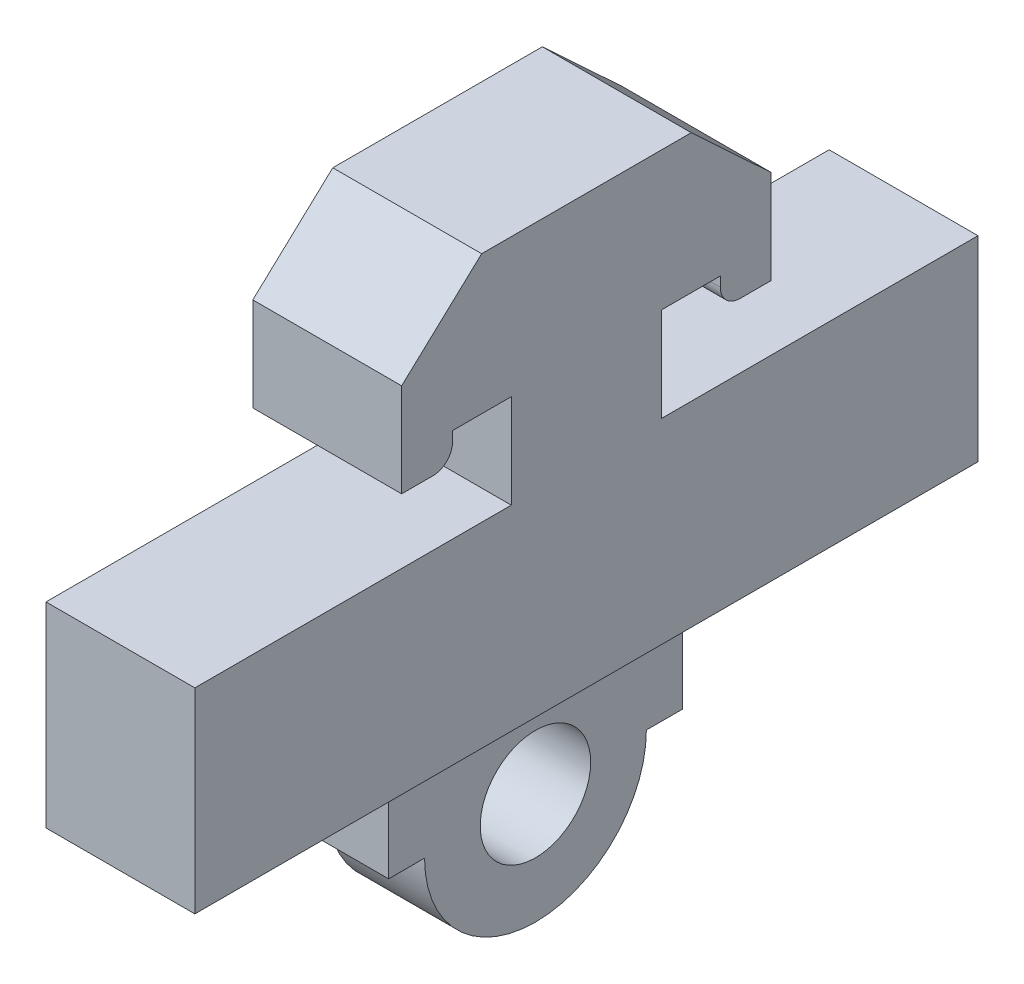
ISO-10303-21;
HEADER;
FILE_DESCRIPTION(('STEP AP214'),'2;1');
FILE_NAME('part.step','',(''),(''),'','','');
FILE_SCHEMA(('AUTOMOTIVE_DESIGN { 1 0 10303 214 1 1 1 1 }'));
ENDSEC;
DATA;
#1=APPLICATION_CONTEXT('core data for automotive mechanical design processes');
#2=APPLICATION_PROTOCOL_DEFINITION('international standard','automotive_design',2000,#1);
#3=PRODUCT_CONTEXT('',#1,'mechanical');
#4=PRODUCT('Part','Part','',(#3));
#5=PRODUCT_RELATED_PRODUCT_CATEGORY('part','',(#4));
#6=PRODUCT_DEFINITION_FORMATION('','',#4);
#7=PRODUCT_DEFINITION_CONTEXT('part definition',#1,'design');
#8=PRODUCT_DEFINITION('design','',#6,#7);
#9=PRODUCT_DEFINITION_SHAPE('','',#8);
#10=(LENGTH_UNIT() NAMED_UNIT(*) SI_UNIT(.MILLI.,.METRE.));
#11=(NAMED_UNIT(*) PLANE_ANGLE_UNIT() SI_UNIT($,.RADIAN.));
#12=(NAMED_UNIT(*) SI_UNIT($,.STERADIAN.) SOLID_ANGLE_UNIT());
#13=UNCERTAINTY_MEASURE_WITH_UNIT(LENGTH_MEASURE(1.E-05),#10,'distance_accuracy_value','');
#14=(GEOMETRIC_REPRESENTATION_CONTEXT(3) GLOBAL_UNCERTAINTY_ASSIGNED_CONTEXT((#13)) GLOBAL_UNIT_ASSIGNED_CONTEXT((#10,
#11,#12)) REPRESENTATION_CONTEXT('',''));
#15=CARTESIAN_POINT('',(0.,0.,0.));
#16=DIRECTION('',(0.,0.,1.));
#17=DIRECTION('',(1.,0.,0.));
#18=AXIS2_PLACEMENT_3D('',#15,#16,#17);
#19=CARTESIAN_POINT('',(0.,10.,0.));
#20=DIRECTION('',(0.,-1.,0.));
#21=DIRECTION('',(0.,0.,-1.));
#22=AXIS2_PLACEMENT_3D('',#19,#20,#21);
#23=PLANE('',#22);
#24=DIRECTION('',(-1.,0.,0.));
#25=VECTOR('',#24,1.);
#26=CARTESIAN_POINT('',(64.7036979563974,10.,-3.83822735647703));
#27=LINE('',#26,#25);
#28=CARTESIAN_POINT('',(-34.7966718517997,10.,-3.83822735647703));
#29=VERTEX_POINT('',#28);
#30=CARTESIAN_POINT('',(-42.4,10.,-3.83822735647703));
#31=VERTEX_POINT('',#30);
#32=EDGE_CURVE('E257',#29,#31,#27,.T.);
#33=ORIENTED_EDGE('',*,*,#32,.F.);
#34=DIRECTION('',(0.,0.,-1.));
#35=VECTOR('',#34,1.);
#36=CARTESIAN_POINT('',(-34.7966718517997,10.,0.));
#37=LINE('',#36,#35);
#38=CARTESIAN_POINT('',(-34.7966718517997,10.,-20.));
#39=VERTEX_POINT('',#38);
#40=EDGE_CURVE('E393',#29,#39,#37,.T.);
#41=ORIENTED_EDGE('',*,*,#40,.T.);
#42=DIRECTION('',(-1.,0.,0.));
#43=VECTOR('',#42,1.);
#44=CARTESIAN_POINT('',(-37.4,10.,-20.));
#45=LINE('',#44,#43);
#46=CARTESIAN_POINT('',(-42.4,10.,-20.));
#47=VERTEX_POINT('',#46);
#48=EDGE_CURVE('E336',#39,#47,#45,.T.);
#49=ORIENTED_EDGE('',*,*,#48,.T.);
#50=DIRECTION('',(0.,0.,1.));
#51=VECTOR('',#50,1.);
#52=CARTESIAN_POINT('',(-42.4,10.,0.));
#53=LINE('',#52,#51);
#54=EDGE_CURVE('E288',#47,#31,#53,.T.);
#55=ORIENTED_EDGE('',*,*,#54,.T.);
#56=EDGE_LOOP('',(#33,#41,#49,#55));
#57=FACE_BOUND('',#56,.T.);
#58=ADVANCED_FACE('F38',(#57),#23,.F.);
#59=CARTESIAN_POINT('',(-37.4,10.,-20.));
#60=DIRECTION('',(0.,0.,1.));
#61=DIRECTION('',(1.,0.,0.));
#62=AXIS2_PLACEMENT_3D('',#59,#60,#61);
#63=PLANE('',#62);
#64=ORIENTED_EDGE('',*,*,#48,.F.);
#65=DIRECTION('',(0.,1.,0.));
#66=VECTOR('',#65,1.);
#67=CARTESIAN_POINT('',(-34.7966718517997,-37.12,-20.));
#68=LINE('',#67,#66);
#69=CARTESIAN_POINT('',(-34.7966718517997,0.,-20.));
#70=VERTEX_POINT('',#69);
#71=EDGE_CURVE('E228',#70,#39,#68,.T.);
#72=ORIENTED_EDGE('',*,*,#71,.F.);
#73=DIRECTION('',(-1.,0.,0.));
#74=VECTOR('',#73,1.);
#75=CARTESIAN_POINT('',(-37.4,0.,-20.));
#76=LINE('',#75,#74);
#77=CARTESIAN_POINT('',(-42.4,0.,-20.));
#78=VERTEX_POINT('',#77);
#79=EDGE_CURVE('E335',#70,#78,#76,.T.);
#80=ORIENTED_EDGE('',*,*,#79,.T.);
#81=DIRECTION('',(0.,1.,0.));
#82=VECTOR('',#81,1.);
#83=CARTESIAN_POINT('',(-42.4,0.,-20.));
#84=LINE('',#83,#82);
#85=EDGE_CURVE('E291',#78,#47,#84,.T.);
#86=ORIENTED_EDGE('',*,*,#85,.T.);
#87=EDGE_LOOP('',(#64,#72,#80,#86));
#88=FACE_BOUND('',#87,.T.);
#89=ADVANCED_FACE('F40',(#88),#63,.F.);
#90=CARTESIAN_POINT('',(-37.4,10.,20.));
#91=DIRECTION('',(0.,0.,-1.));
#92=DIRECTION('',(-1.,0.,0.));
#93=AXIS2_PLACEMENT_3D('',#90,#91,#92);
#94=PLANE('',#93);
#95=DIRECTION('',(1.,0.,0.));
#96=VECTOR('',#95,1.);
#97=CARTESIAN_POINT('',(-37.4,0.,20.));
#98=LINE('',#97,#96);
#99=CARTESIAN_POINT('',(-42.4,0.,20.));
#100=VERTEX_POINT('',#99);
#101=CARTESIAN_POINT('',(-34.7966718517997,0.,20.));
#102=VERTEX_POINT('',#101);
#103=EDGE_CURVE('E338',#100,#102,#98,.T.);
#104=ORIENTED_EDGE('',*,*,#103,.T.);
#105=DIRECTION('',(0.,1.,0.));
#106=VECTOR('',#105,1.);
#107=CARTESIAN_POINT('',(-34.7966718517997,-37.12,20.));
#108=LINE('',#107,#106);
#109=CARTESIAN_POINT('',(-34.7966718517997,10.,20.));
#110=VERTEX_POINT('',#109);
#111=EDGE_CURVE('E348',#102,#110,#108,.T.);
#112=ORIENTED_EDGE('',*,*,#111,.T.);
#113=DIRECTION('',(1.,0.,0.));
#114=VECTOR('',#113,1.);
#115=CARTESIAN_POINT('',(-37.4,10.,20.));
#116=LINE('',#115,#114);
#117=CARTESIAN_POINT('',(-42.4,10.,20.));
#118=VERTEX_POINT('',#117);
#119=EDGE_CURVE('E46',#118,#110,#116,.T.);
#120=ORIENTED_EDGE('',*,*,#119,.F.);
#121=DIRECTION('',(0.,-1.,0.));
#122=VECTOR('',#121,1.);
#123=CARTESIAN_POINT('',(-42.4,0.,20.));
#124=LINE('',#123,#122);
#125=EDGE_CURVE('E283',#118,#100,#124,.T.);
#126=ORIENTED_EDGE('',*,*,#125,.T.);
#127=EDGE_LOOP('',(#104,#112,#120,#126));
#128=FACE_BOUND('',#127,.T.);
#129=ADVANCED_FACE('F346',(#128),#94,.F.);
#130=ORIENTED_EDGE('',*,*,#119,.T.);
#131=DIRECTION('',(0.,0.,-1.));
#132=VECTOR('',#131,1.);
#133=CARTESIAN_POINT('',(-34.7966718517997,10.,0.));
#134=LINE('',#133,#132);
#135=CARTESIAN_POINT('',(-34.7966718517997,10.,3.83822735647703));
#136=VERTEX_POINT('',#135);
#137=EDGE_CURVE('E413',#110,#136,#134,.T.);
#138=ORIENTED_EDGE('',*,*,#137,.T.);
#139=DIRECTION('',(-1.,0.,0.));
#140=VECTOR('',#139,1.);
#141=CARTESIAN_POINT('',(64.7036979563974,10.,3.83822735647703));
#142=LINE('',#141,#140);
#143=CARTESIAN_POINT('',(-42.4,10.,3.83822735647703));
#144=VERTEX_POINT('',#143);
#145=EDGE_CURVE('E60',#136,#144,#142,.T.);
#146=ORIENTED_EDGE('',*,*,#145,.T.);
#147=EDGE_CURVE('E287',#144,#118,#53,.T.);
#148=ORIENTED_EDGE('',*,*,#147,.T.);
#149=EDGE_LOOP('',(#130,#138,#146,#148));
#150=FACE_BOUND('',#149,.T.);
#151=ADVANCED_FACE('F470',(#150),#23,.F.);
#152=CARTESIAN_POINT('',(0.,0.,0.));
#153=DIRECTION('',(0.,-1.,0.));
#154=DIRECTION('',(0.,0.,-1.));
#155=AXIS2_PLACEMENT_3D('',#152,#153,#154);
#156=PLANE('',#155);
#157=DIRECTION('',(0.,0.,-1.));
#158=VECTOR('',#157,1.);
#159=CARTESIAN_POINT('',(-34.7966718517997,0.,0.));
#160=LINE('',#159,#158);
#161=EDGE_CURVE('E269',#102,#70,#160,.T.);
#162=ORIENTED_EDGE('',*,*,#161,.F.);
#163=ORIENTED_EDGE('',*,*,#103,.F.);
#164=DIRECTION('',(0.,0.,-1.));
#165=VECTOR('',#164,1.);
#166=CARTESIAN_POINT('',(-42.4,0.,0.));
#167=LINE('',#166,#165);
#168=CARTESIAN_POINT('',(-42.4,0.,7.5));
#169=VERTEX_POINT('',#168);
#170=EDGE_CURVE('E280',#100,#169,#167,.T.);
#171=ORIENTED_EDGE('',*,*,#170,.T.);
#172=DIRECTION('',(1.,0.,0.));
#173=VECTOR('',#172,1.);
#174=CARTESIAN_POINT('',(-42.4,0.,7.5));
#175=LINE('',#174,#173);
#176=CARTESIAN_POINT('',(-37.4,0.,7.5));
#177=VERTEX_POINT('',#176);
#178=EDGE_CURVE('E330',#169,#177,#175,.T.);
#179=ORIENTED_EDGE('',*,*,#178,.T.);
#180=DIRECTION('',(0.,0.,1.));
#181=VECTOR('',#180,1.);
#182=CARTESIAN_POINT('',(-37.4,0.,20.));
#183=LINE('',#182,#181);
#184=CARTESIAN_POINT('',(-37.4,0.,-7.5));
#185=VERTEX_POINT('',#184);
#186=EDGE_CURVE('E342',#185,#177,#183,.T.);
#187=ORIENTED_EDGE('',*,*,#186,.F.);
#188=DIRECTION('',(1.,0.,0.));
#189=VECTOR('',#188,1.);
#190=CARTESIAN_POINT('',(-42.4,0.,-7.5));
#191=LINE('',#190,#189);
#192=CARTESIAN_POINT('',(-42.4,0.,-7.5));
#193=VERTEX_POINT('',#192);
#194=EDGE_CURVE('E327',#193,#185,#191,.T.);
#195=ORIENTED_EDGE('',*,*,#194,.F.);
#196=EDGE_CURVE('E284',#193,#78,#167,.T.);
#197=ORIENTED_EDGE('',*,*,#196,.T.);
#198=ORIENTED_EDGE('',*,*,#79,.F.);
#199=EDGE_LOOP('',(#162,#163,#171,#179,#187,#195,#197,#198));
#200=FACE_BOUND('',#199,.T.);
#201=ADVANCED_FACE('F353',(#200),#156,.T.);
#202=CARTESIAN_POINT('',(-37.4,0.,0.));
#203=DIRECTION('',(-1.,0.,0.));
#204=DIRECTION('',(0.,0.,-1.));
#205=AXIS2_PLACEMENT_3D('',#202,#203,#204);
#206=PLANE('',#205);
#207=CARTESIAN_POINT('',(-37.4,-6.,0.));
#208=DIRECTION('',(1.,0.,0.));
#209=DIRECTION('',(0.,0.,-1.));
#210=AXIS2_PLACEMENT_3D('',#207,#208,#209);
#211=CIRCLE('',#210,2.82);
#212=CARTESIAN_POINT('',(-37.4,-6.,-2.82));
#213=VERTEX_POINT('',#212);
#214=EDGE_CURVE('E304',#213,#213,#211,.T.);
#215=ORIENTED_EDGE('',*,*,#214,.F.);
#216=EDGE_LOOP('',(#215));
#217=FACE_BOUND('',#216,.T.);
#218=DIRECTION('',(0.,1.,0.));
#219=VECTOR('',#218,1.);
#220=CARTESIAN_POINT('',(-37.4,0.,-7.5));
#221=LINE('',#220,#219);
#222=CARTESIAN_POINT('',(-37.4,-6.,-7.5));
#223=VERTEX_POINT('',#222);
#224=EDGE_CURVE('E314',#223,#185,#221,.T.);
#225=ORIENTED_EDGE('',*,*,#224,.T.);
#226=ORIENTED_EDGE('',*,*,#186,.T.);
#227=DIRECTION('',(0.,-1.,0.));
#228=VECTOR('',#227,1.);
#229=CARTESIAN_POINT('',(-37.4,0.,7.5));
#230=LINE('',#229,#228);
#231=CARTESIAN_POINT('',(-37.4,-6.,7.5));
#232=VERTEX_POINT('',#231);
#233=EDGE_CURVE('E311',#177,#232,#230,.T.);
#234=ORIENTED_EDGE('',*,*,#233,.T.);
#235=DIRECTION('',(0.,0.,-1.));
#236=VECTOR('',#235,1.);
#237=CARTESIAN_POINT('',(-37.4,-6.,0.));
#238=LINE('',#237,#236);
#239=CARTESIAN_POINT('',(-37.4,-6.,5.665));
#240=VERTEX_POINT('',#239);
#241=EDGE_CURVE('E307',#232,#240,#238,.T.);
#242=ORIENTED_EDGE('',*,*,#241,.T.);
#243=CARTESIAN_POINT('',(-37.4,-6.,0.));
#244=DIRECTION('',(1.,0.,0.));
#245=DIRECTION('',(0.,0.,-1.));
#246=AXIS2_PLACEMENT_3D('',#243,#244,#245);
#247=CIRCLE('',#246,5.665);
#248=CARTESIAN_POINT('',(-37.4,-6.,-5.665));
#249=VERTEX_POINT('',#248);
#250=EDGE_CURVE('E274',#240,#249,#247,.T.);
#251=ORIENTED_EDGE('',*,*,#250,.T.);
#252=DIRECTION('',(0.,0.,-1.));
#253=VECTOR('',#252,1.);
#254=CARTESIAN_POINT('',(-37.4,-6.,0.));
#255=LINE('',#254,#253);
#256=EDGE_CURVE('E317',#249,#223,#255,.T.);
#257=ORIENTED_EDGE('',*,*,#256,.T.);
#258=EDGE_LOOP('',(#225,#226,#234,#242,#251,#257));
#259=FACE_BOUND('',#258,.T.);
#260=ADVANCED_FACE('F371',(#217,#259),#206,.F.);
#261=CARTESIAN_POINT('',(-42.4,-6.,0.));
#262=DIRECTION('',(0.,-1.,0.));
#263=DIRECTION('',(0.,0.,-1.));
#264=AXIS2_PLACEMENT_3D('',#261,#262,#263);
#265=PLANE('',#264);
#266=ORIENTED_EDGE('',*,*,#241,.F.);
#267=DIRECTION('',(1.,0.,0.));
#268=VECTOR('',#267,1.);
#269=CARTESIAN_POINT('',(-42.4,-6.,7.5));
#270=LINE('',#269,#268);
#271=CARTESIAN_POINT('',(-42.4,-6.,7.5));
#272=VERTEX_POINT('',#271);
#273=EDGE_CURVE('E333',#272,#232,#270,.T.);
#274=ORIENTED_EDGE('',*,*,#273,.F.);
#275=DIRECTION('',(0.,0.,-1.));
#276=VECTOR('',#275,1.);
#277=CARTESIAN_POINT('',(-42.4,-6.,0.));
#278=LINE('',#277,#276);
#279=CARTESIAN_POINT('',(-42.4,-6.,5.665));
#280=VERTEX_POINT('',#279);
#281=EDGE_CURVE('E273',#272,#280,#278,.T.);
#282=ORIENTED_EDGE('',*,*,#281,.T.);
#283=DIRECTION('',(1.,0.,0.));
#284=VECTOR('',#283,1.);
#285=CARTESIAN_POINT('',(-42.4,-6.,5.665));
#286=LINE('',#285,#284);
#287=EDGE_CURVE('E303',#280,#240,#286,.T.);
#288=ORIENTED_EDGE('',*,*,#287,.T.);
#289=EDGE_LOOP('',(#266,#274,#282,#288));
#290=FACE_BOUND('',#289,.T.);
#291=ADVANCED_FACE('F730',(#290),#265,.T.);
#292=CARTESIAN_POINT('',(-42.4,0.,7.5));
#293=DIRECTION('',(0.,0.,1.));
#294=DIRECTION('',(0.,-1.,0.));
#295=AXIS2_PLACEMENT_3D('',#292,#293,#294);
#296=PLANE('',#295);
#297=ORIENTED_EDGE('',*,*,#233,.F.);
#298=ORIENTED_EDGE('',*,*,#178,.F.);
#299=DIRECTION('',(0.,-1.,0.));
#300=VECTOR('',#299,1.);
#301=CARTESIAN_POINT('',(-42.4,0.,7.5));
#302=LINE('',#301,#300);
#303=EDGE_CURVE('E277',#169,#272,#302,.T.);
#304=ORIENTED_EDGE('',*,*,#303,.T.);
#305=ORIENTED_EDGE('',*,*,#273,.T.);
#306=EDGE_LOOP('',(#297,#298,#304,#305));
#307=FACE_BOUND('',#306,.T.);
#308=ADVANCED_FACE('F362',(#307),#296,.T.);
#309=CARTESIAN_POINT('',(-42.4,0.,-7.5));
#310=DIRECTION('',(0.,0.,-1.));
#311=DIRECTION('',(0.,1.,0.));
#312=AXIS2_PLACEMENT_3D('',#309,#310,#311);
#313=PLANE('',#312);
#314=ORIENTED_EDGE('',*,*,#224,.F.);
#315=DIRECTION('',(1.,0.,0.));
#316=VECTOR('',#315,1.);
#317=CARTESIAN_POINT('',(-42.4,-6.,-7.5));
#318=LINE('',#317,#316);
#319=CARTESIAN_POINT('',(-42.4,-6.,-7.5));
#320=VERTEX_POINT('',#319);
#321=EDGE_CURVE('E325',#320,#223,#318,.T.);
#322=ORIENTED_EDGE('',*,*,#321,.F.);
#323=DIRECTION('',(0.,1.,0.));
#324=VECTOR('',#323,1.);
#325=CARTESIAN_POINT('',(-42.4,0.,-7.5));
#326=LINE('',#325,#324);
#327=EDGE_CURVE('E294',#320,#193,#326,.T.);
#328=ORIENTED_EDGE('',*,*,#327,.T.);
#329=ORIENTED_EDGE('',*,*,#194,.T.);
#330=EDGE_LOOP('',(#314,#322,#328,#329));
#331=FACE_BOUND('',#330,.T.);
#332=ADVANCED_FACE('F369',(#331),#313,.T.);
#333=CARTESIAN_POINT('',(-42.4,-6.,0.));
#334=DIRECTION('',(0.,-1.,0.));
#335=DIRECTION('',(0.,0.,-1.));
#336=AXIS2_PLACEMENT_3D('',#333,#334,#335);
#337=PLANE('',#336);
#338=ORIENTED_EDGE('',*,*,#256,.F.);
#339=DIRECTION('',(1.,0.,0.));
#340=VECTOR('',#339,1.);
#341=CARTESIAN_POINT('',(-42.4,-6.,-5.665));
#342=LINE('',#341,#340);
#343=CARTESIAN_POINT('',(-42.4,-6.,-5.665));
#344=VERTEX_POINT('',#343);
#345=EDGE_CURVE('E323',#344,#249,#342,.T.);
#346=ORIENTED_EDGE('',*,*,#345,.F.);
#347=DIRECTION('',(0.,0.,-1.));
#348=VECTOR('',#347,1.);
#349=CARTESIAN_POINT('',(-42.4,-6.,0.));
#350=LINE('',#349,#348);
#351=EDGE_CURVE('E297',#344,#320,#350,.T.);
#352=ORIENTED_EDGE('',*,*,#351,.T.);
#353=ORIENTED_EDGE('',*,*,#321,.T.);
#354=EDGE_LOOP('',(#338,#346,#352,#353));
#355=FACE_BOUND('',#354,.T.);
#356=ADVANCED_FACE('F375',(#355),#337,.T.);
#357=CARTESIAN_POINT('',(-42.4,-6.,0.));
#358=DIRECTION('',(1.,0.,0.));
#359=DIRECTION('',(0.,0.,-1.));
#360=AXIS2_PLACEMENT_3D('',#357,#358,#359);
#361=CYLINDRICAL_SURFACE('',#360,2.82);
#362=CARTESIAN_POINT('',(-42.4,-6.,0.));
#363=DIRECTION('',(1.,0.,0.));
#364=DIRECTION('',(0.,0.,-1.));
#365=AXIS2_PLACEMENT_3D('',#362,#363,#364);
#366=CIRCLE('',#365,2.82);
#367=CARTESIAN_POINT('',(-42.4,-6.,-2.82));
#368=VERTEX_POINT('',#367);
#369=EDGE_CURVE('E270',#368,#368,#366,.T.);
#370=ORIENTED_EDGE('',*,*,#369,.F.);
#371=EDGE_LOOP('',(#370));
#372=FACE_BOUND('',#371,.T.);
#373=ORIENTED_EDGE('',*,*,#214,.T.);
#374=EDGE_LOOP('',(#373));
#375=FACE_BOUND('',#374,.T.);
#376=ADVANCED_FACE('F696',(#372,#375),#361,.F.);
#377=CARTESIAN_POINT('',(-42.4,-6.,0.));
#378=DIRECTION('',(1.,0.,0.));
#379=DIRECTION('',(0.,0.,-1.));
#380=AXIS2_PLACEMENT_3D('',#377,#378,#379);
#381=CYLINDRICAL_SURFACE('',#380,5.665);
#382=ORIENTED_EDGE('',*,*,#250,.F.);
#383=ORIENTED_EDGE('',*,*,#287,.F.);
#384=CARTESIAN_POINT('',(-42.4,-6.,0.));
#385=DIRECTION('',(1.,0.,0.));
#386=DIRECTION('',(0.,0.,-1.));
#387=AXIS2_PLACEMENT_3D('',#384,#385,#386);
#388=CIRCLE('',#387,5.665);
#389=EDGE_CURVE('E300',#280,#344,#388,.T.);
#390=ORIENTED_EDGE('',*,*,#389,.T.);
#391=ORIENTED_EDGE('',*,*,#345,.T.);
#392=EDGE_LOOP('',(#382,#383,#390,#391));
#393=FACE_BOUND('',#392,.T.);
#394=ADVANCED_FACE('F686',(#393),#381,.T.);
#395=CARTESIAN_POINT('',(-42.4,0.,0.));
#396=DIRECTION('',(-1.,0.,0.));
#397=DIRECTION('',(0.,0.,-1.));
#398=AXIS2_PLACEMENT_3D('',#395,#396,#397);
#399=PLANE('',#398);
#400=ORIENTED_EDGE('',*,*,#369,.T.);
#401=EDGE_LOOP('',(#400));
#402=FACE_BOUND('',#401,.T.);
#403=ORIENTED_EDGE('',*,*,#281,.F.);
#404=ORIENTED_EDGE('',*,*,#303,.F.);
#405=ORIENTED_EDGE('',*,*,#170,.F.);
#406=ORIENTED_EDGE('',*,*,#125,.F.);
#407=ORIENTED_EDGE('',*,*,#147,.F.);
#408=DIRECTION('',(0.,1.,0.));
#409=VECTOR('',#408,1.);
#410=CARTESIAN_POINT('',(-42.4,0.,3.83822735647703));
#411=LINE('',#410,#409);
#412=CARTESIAN_POINT('',(-42.4,14.8,3.83822735647703));
#413=VERTEX_POINT('',#412);
#414=EDGE_CURVE('E440',#144,#413,#411,.T.);
#415=ORIENTED_EDGE('',*,*,#414,.T.);
#416=DIRECTION('',(0.,0.,1.));
#417=VECTOR('',#416,1.);
#418=CARTESIAN_POINT('',(-42.4,14.8,0.));
#419=LINE('',#418,#417);
#420=CARTESIAN_POINT('',(-42.4,14.8,6.83822735647704));
#421=VERTEX_POINT('',#420);
#422=EDGE_CURVE('E437',#413,#421,#419,.T.);
#423=ORIENTED_EDGE('',*,*,#422,.T.);
#424=DIRECTION('',(0.,-1.,0.));
#425=VECTOR('',#424,1.);
#426=CARTESIAN_POINT('',(-42.4,0.,6.83822735647701));
#427=LINE('',#426,#425);
#428=CARTESIAN_POINT('',(-42.4,14.3,6.83822735647704));
#429=VERTEX_POINT('',#428);
#430=EDGE_CURVE('E434',#421,#429,#427,.T.);
#431=ORIENTED_EDGE('',*,*,#430,.T.);
#432=CARTESIAN_POINT('',(-42.4,14.3,7.83822735647704));
#433=DIRECTION('',(-1.,0.,0.));
#434=DIRECTION('',(0.,0.,1.));
#435=AXIS2_PLACEMENT_3D('',#432,#433,#434);
#436=CIRCLE('',#435,1.);
#437=CARTESIAN_POINT('',(-42.4,13.3,7.83822735647704));
#438=VERTEX_POINT('',#437);
#439=EDGE_CURVE('E431',#429,#438,#436,.T.);
#440=ORIENTED_EDGE('',*,*,#439,.T.);
#441=DIRECTION('',(0.,0.,1.));
#442=VECTOR('',#441,1.);
#443=CARTESIAN_POINT('',(-42.4,13.3,0.));
#444=LINE('',#443,#442);
#445=CARTESIAN_POINT('',(-42.4,13.3,9.43822735647704));
#446=VERTEX_POINT('',#445);
#447=EDGE_CURVE('E426',#438,#446,#444,.T.);
#448=ORIENTED_EDGE('',*,*,#447,.T.);
#449=DIRECTION('',(0.,-1.,0.));
#450=VECTOR('',#449,1.);
#451=CARTESIAN_POINT('',(-42.4,0.,9.43822735647704));
#452=LINE('',#451,#450);
#453=CARTESIAN_POINT('',(-42.4,18.08,9.43822735647704));
#454=VERTEX_POINT('',#453);
#455=EDGE_CURVE('E245',#454,#446,#452,.T.);
#456=ORIENTED_EDGE('',*,*,#455,.F.);
#457=DIRECTION('',(0.,0.681003584229391,-0.732280081844865));
#458=VECTOR('',#457,1.);
#459=CARTESIAN_POINT('',(-42.4,14.4018186690279,13.393359147938));
#460=LINE('',#459,#458);
#461=CARTESIAN_POINT('',(-42.4,21.88,5.35210449978269));
#462=VERTEX_POINT('',#461);
#463=EDGE_CURVE('E422',#454,#462,#460,.T.);
#464=ORIENTED_EDGE('',*,*,#463,.T.);
#465=DIRECTION('',(0.,0.,1.));
#466=VECTOR('',#465,1.);
#467=CARTESIAN_POINT('',(-42.4,21.88,0.));
#468=LINE('',#467,#466);
#469=CARTESIAN_POINT('',(-42.4,21.88,-5.35210449978269));
#470=VERTEX_POINT('',#469);
#471=EDGE_CURVE('E234',#470,#462,#468,.T.);
#472=ORIENTED_EDGE('',*,*,#471,.F.);
#473=DIRECTION('',(0.,0.681003584229391,0.732280081844865));
#474=VECTOR('',#473,1.);
#475=CARTESIAN_POINT('',(-42.4,14.4018186690279,-13.393359147938));
#476=LINE('',#475,#474);
#477=CARTESIAN_POINT('',(-42.4,18.08,-9.43822735647704));
#478=VERTEX_POINT('',#477);
#479=EDGE_CURVE('E232',#478,#470,#476,.T.);
#480=ORIENTED_EDGE('',*,*,#479,.F.);
#481=DIRECTION('',(0.,-1.,0.));
#482=VECTOR('',#481,1.);
#483=CARTESIAN_POINT('',(-42.4,0.,-9.43822735647704));
#484=LINE('',#483,#482);
#485=CARTESIAN_POINT('',(-42.4,13.3,-9.43822735647704));
#486=VERTEX_POINT('',#485);
#487=EDGE_CURVE('E308',#478,#486,#484,.T.);
#488=ORIENTED_EDGE('',*,*,#487,.T.);
#489=DIRECTION('',(0.,0.,-1.));
#490=VECTOR('',#489,1.);
#491=CARTESIAN_POINT('',(-42.4,13.3,0.));
#492=LINE('',#491,#490);
#493=CARTESIAN_POINT('',(-42.4,13.3,-7.83822735647704));
#494=VERTEX_POINT('',#493);
#495=EDGE_CURVE('E416',#494,#486,#492,.T.);
#496=ORIENTED_EDGE('',*,*,#495,.F.);
#497=CARTESIAN_POINT('',(-42.4,14.3,-7.83822735647704));
#498=DIRECTION('',(-1.,0.,0.));
#499=DIRECTION('',(0.,0.,1.));
#500=AXIS2_PLACEMENT_3D('',#497,#498,#499);
#501=CIRCLE('',#500,1.);
#502=CARTESIAN_POINT('',(-42.4,14.3,-6.83822735647704));
#503=VERTEX_POINT('',#502);
#504=EDGE_CURVE('E268',#503,#494,#501,.F.);
#505=ORIENTED_EDGE('',*,*,#504,.F.);
#506=DIRECTION('',(0.,-1.,0.));
#507=VECTOR('',#506,1.);
#508=CARTESIAN_POINT('',(-42.4,0.,-6.83822735647701));
#509=LINE('',#508,#507);
#510=CARTESIAN_POINT('',(-42.4,14.8,-6.83822735647704));
#511=VERTEX_POINT('',#510);
#512=EDGE_CURVE('E265',#511,#503,#509,.T.);
#513=ORIENTED_EDGE('',*,*,#512,.F.);
#514=DIRECTION('',(0.,0.,-1.));
#515=VECTOR('',#514,1.);
#516=CARTESIAN_POINT('',(-42.4,14.8,0.));
#517=LINE('',#516,#515);
#518=CARTESIAN_POINT('',(-42.4,14.8,-3.83822735647703));
#519=VERTEX_POINT('',#518);
#520=EDGE_CURVE('E262',#519,#511,#517,.T.);
#521=ORIENTED_EDGE('',*,*,#520,.F.);
#522=DIRECTION('',(0.,1.,0.));
#523=VECTOR('',#522,1.);
#524=CARTESIAN_POINT('',(-42.4,0.,-3.83822735647703));
#525=LINE('',#524,#523);
#526=EDGE_CURVE('E259',#31,#519,#525,.T.);
#527=ORIENTED_EDGE('',*,*,#526,.F.);
#528=ORIENTED_EDGE('',*,*,#54,.F.);
#529=ORIENTED_EDGE('',*,*,#85,.F.);
#530=ORIENTED_EDGE('',*,*,#196,.F.);
#531=ORIENTED_EDGE('',*,*,#327,.F.);
#532=ORIENTED_EDGE('',*,*,#351,.F.);
#533=ORIENTED_EDGE('',*,*,#389,.F.);
#534=EDGE_LOOP('',(#403,#404,#405,#406,#407,#415,#423,#431,#440,#448,#456,#464,#472,#480,#488,
#496,#505,#513,#521,#527,#528,#529,#530,#531,#532,#533));
#535=FACE_BOUND('',#534,.T.);
#536=ADVANCED_FACE('F358',(#402,#535),#399,.T.);
#537=CARTESIAN_POINT('',(64.7036979563974,14.3,-7.83822735647704));
#538=DIRECTION('',(-1.,0.,0.));
#539=DIRECTION('',(0.,0.,1.));
#540=AXIS2_PLACEMENT_3D('',#537,#538,#539);
#541=CYLINDRICAL_SURFACE('',#540,1.);
#542=DIRECTION('',(-1.,0.,0.));
#543=VECTOR('',#542,1.);
#544=CARTESIAN_POINT('',(64.7036979563974,13.3,-7.83822735647704));
#545=LINE('',#544,#543);
#546=CARTESIAN_POINT('',(-34.7966718517997,13.3,-7.83822735647704));
#547=VERTEX_POINT('',#546);
#548=EDGE_CURVE('E420',#547,#494,#545,.T.);
#549=ORIENTED_EDGE('',*,*,#548,.F.);
#550=CARTESIAN_POINT('',(-34.7966718517997,14.3,-7.83822735647704));
#551=DIRECTION('',(-1.,0.,0.));
#552=DIRECTION('',(0.,0.,1.));
#553=AXIS2_PLACEMENT_3D('',#550,#551,#552);
#554=CIRCLE('',#553,1.);
#555=CARTESIAN_POINT('',(-34.7966718517997,14.3,-6.83822735647704));
#556=VERTEX_POINT('',#555);
#557=EDGE_CURVE('E390',#547,#556,#554,.T.);
#558=ORIENTED_EDGE('',*,*,#557,.T.);
#559=DIRECTION('',(-1.,0.,0.));
#560=VECTOR('',#559,1.);
#561=CARTESIAN_POINT('',(64.7036979563974,14.3,-6.83822735647704));
#562=LINE('',#561,#560);
#563=EDGE_CURVE('E266',#556,#503,#562,.T.);
#564=ORIENTED_EDGE('',*,*,#563,.T.);
#565=ORIENTED_EDGE('',*,*,#504,.T.);
#566=EDGE_LOOP('',(#549,#558,#564,#565));
#567=FACE_BOUND('',#566,.T.);
#568=ADVANCED_FACE('F464',(#567),#541,.T.);
#569=CARTESIAN_POINT('',(64.7036979563974,13.3,0.));
#570=DIRECTION('',(0.,1.,0.));
#571=DIRECTION('',(0.,0.,1.));
#572=AXIS2_PLACEMENT_3D('',#569,#570,#571);
#573=PLANE('',#572);
#574=DIRECTION('',(-1.,0.,0.));
#575=VECTOR('',#574,1.);
#576=CARTESIAN_POINT('',(64.7036979563974,13.3,-9.43822735647704));
#577=LINE('',#576,#575);
#578=CARTESIAN_POINT('',(-34.7966718517997,13.3,-9.43822735647704));
#579=VERTEX_POINT('',#578);
#580=EDGE_CURVE('E419',#579,#486,#577,.T.);
#581=ORIENTED_EDGE('',*,*,#580,.F.);
#582=DIRECTION('',(0.,0.,1.));
#583=VECTOR('',#582,1.);
#584=CARTESIAN_POINT('',(-34.7966718517997,13.3,0.));
#585=LINE('',#584,#583);
#586=EDGE_CURVE('E395',#579,#547,#585,.T.);
#587=ORIENTED_EDGE('',*,*,#586,.T.);
#588=ORIENTED_EDGE('',*,*,#548,.T.);
#589=ORIENTED_EDGE('',*,*,#495,.T.);
#590=EDGE_LOOP('',(#581,#587,#588,#589));
#591=FACE_BOUND('',#590,.T.);
#592=ADVANCED_FACE('F457',(#591),#573,.F.);
#593=CARTESIAN_POINT('',(64.7036979563974,0.,-9.43822735647704));
#594=DIRECTION('',(0.,0.,-1.));
#595=DIRECTION('',(-1.,0.,0.));
#596=AXIS2_PLACEMENT_3D('',#593,#594,#595);
#597=PLANE('',#596);
#598=DIRECTION('',(0.,1.,0.));
#599=VECTOR('',#598,1.);
#600=CARTESIAN_POINT('',(-34.7966718517997,0.,-9.43822735647704));
#601=LINE('',#600,#599);
#602=CARTESIAN_POINT('',(-34.7966718517997,18.08,-9.43822735647704));
#603=VERTEX_POINT('',#602);
#604=EDGE_CURVE('E215',#579,#603,#601,.T.);
#605=ORIENTED_EDGE('',*,*,#604,.F.);
#606=ORIENTED_EDGE('',*,*,#580,.T.);
#607=ORIENTED_EDGE('',*,*,#487,.F.);
#608=DIRECTION('',(-1.,0.,0.));
#609=VECTOR('',#608,1.);
#610=CARTESIAN_POINT('',(64.7036979563974,18.08,-9.43822735647704));
#611=LINE('',#610,#609);
#612=EDGE_CURVE('E237',#603,#478,#611,.T.);
#613=ORIENTED_EDGE('',*,*,#612,.F.);
#614=EDGE_LOOP('',(#605,#606,#607,#613));
#615=FACE_BOUND('',#614,.T.);
#616=ADVANCED_FACE('F455',(#615),#597,.T.);
#617=CARTESIAN_POINT('',(64.7036979563974,14.4018186690279,-13.393359147938));
#618=DIRECTION('',(0.,-0.732280081844865,0.681003584229391));
#619=DIRECTION('',(0.,-0.681003584229391,-0.732280081844865));
#620=AXIS2_PLACEMENT_3D('',#617,#618,#619);
#621=PLANE('',#620);
#622=DIRECTION('',(-1.,0.,0.));
#623=VECTOR('',#622,1.);
#624=CARTESIAN_POINT('',(64.7036979563974,21.88,-5.35210449978269));
#625=LINE('',#624,#623);
#626=CARTESIAN_POINT('',(-34.7966718517997,21.88,-5.35210449978269));
#627=VERTEX_POINT('',#626);
#628=EDGE_CURVE('E225',#627,#470,#625,.T.);
#629=ORIENTED_EDGE('',*,*,#628,.F.);
#630=DIRECTION('',(0.,-0.681003584229391,-0.732280081844865));
#631=VECTOR('',#630,1.);
#632=CARTESIAN_POINT('',(-34.7966718517997,14.4018186690279,-13.393359147938));
#633=LINE('',#632,#631);
#634=EDGE_CURVE('E209',#627,#603,#633,.T.);
#635=ORIENTED_EDGE('',*,*,#634,.T.);
#636=ORIENTED_EDGE('',*,*,#612,.T.);
#637=ORIENTED_EDGE('',*,*,#479,.T.);
#638=EDGE_LOOP('',(#629,#635,#636,#637));
#639=FACE_BOUND('',#638,.T.);
#640=ADVANCED_FACE('F230',(#639),#621,.F.);
#641=CARTESIAN_POINT('',(64.7036979563974,21.88,0.));
#642=DIRECTION('',(0.,-1.,0.));
#643=DIRECTION('',(0.,0.,-1.));
#644=AXIS2_PLACEMENT_3D('',#641,#642,#643);
#645=PLANE('',#644);
#646=DIRECTION('',(-1.,0.,0.));
#647=VECTOR('',#646,1.);
#648=CARTESIAN_POINT('',(64.7036979563974,21.88,5.35210449978269));
#649=LINE('',#648,#647);
#650=CARTESIAN_POINT('',(-34.7966718517997,21.88,5.35210449978269));
#651=VERTEX_POINT('',#650);
#652=EDGE_CURVE('E227',#651,#462,#649,.T.);
#653=ORIENTED_EDGE('',*,*,#652,.F.);
#654=DIRECTION('',(0.,0.,1.));
#655=VECTOR('',#654,1.);
#656=CARTESIAN_POINT('',(-34.7966718517997,21.88,-20.));
#657=LINE('',#656,#655);
#658=EDGE_CURVE('E212',#627,#651,#657,.T.);
#659=ORIENTED_EDGE('',*,*,#658,.F.);
#660=ORIENTED_EDGE('',*,*,#628,.T.);
#661=ORIENTED_EDGE('',*,*,#471,.T.);
#662=EDGE_LOOP('',(#653,#659,#660,#661));
#663=FACE_BOUND('',#662,.T.);
#664=ADVANCED_FACE('F223',(#663),#645,.F.);
#665=CARTESIAN_POINT('',(64.7036979563974,14.4018186690279,13.393359147938));
#666=DIRECTION('',(0.,0.732280081844865,0.681003584229391));
#667=DIRECTION('',(0.,-0.681003584229391,0.732280081844865));
#668=AXIS2_PLACEMENT_3D('',#665,#666,#667);
#669=PLANE('',#668);
#670=DIRECTION('',(0.,-0.681003584229391,0.732280081844865));
#671=VECTOR('',#670,1.);
#672=CARTESIAN_POINT('',(-34.7966718517997,14.4018186690279,13.393359147938));
#673=LINE('',#672,#671);
#674=CARTESIAN_POINT('',(-34.7966718517997,18.08,9.43822735647704));
#675=VERTEX_POINT('',#674);
#676=EDGE_CURVE('E411',#651,#675,#673,.T.);
#677=ORIENTED_EDGE('',*,*,#676,.F.);
#678=ORIENTED_EDGE('',*,*,#652,.T.);
#679=ORIENTED_EDGE('',*,*,#463,.F.);
#680=DIRECTION('',(-1.,0.,0.));
#681=VECTOR('',#680,1.);
#682=CARTESIAN_POINT('',(64.7036979563974,18.08,9.43822735647704));
#683=LINE('',#682,#681);
#684=EDGE_CURVE('E243',#675,#454,#683,.T.);
#685=ORIENTED_EDGE('',*,*,#684,.F.);
#686=EDGE_LOOP('',(#677,#678,#679,#685));
#687=FACE_BOUND('',#686,.T.);
#688=ADVANCED_FACE('F512',(#687),#669,.T.);
#689=CARTESIAN_POINT('',(64.7036979563974,0.,9.43822735647704));
#690=DIRECTION('',(0.,0.,-1.));
#691=DIRECTION('',(-1.,0.,0.));
#692=AXIS2_PLACEMENT_3D('',#689,#690,#691);
#693=PLANE('',#692);
#694=DIRECTION('',(-1.,0.,0.));
#695=VECTOR('',#694,1.);
#696=CARTESIAN_POINT('',(64.7036979563974,13.3,9.43822735647704));
#697=LINE('',#696,#695);
#698=CARTESIAN_POINT('',(-34.7966718517997,13.3,9.43822735647704));
#699=VERTEX_POINT('',#698);
#700=EDGE_CURVE('E246',#699,#446,#697,.T.);
#701=ORIENTED_EDGE('',*,*,#700,.F.);
#702=DIRECTION('',(0.,1.,0.));
#703=VECTOR('',#702,1.);
#704=CARTESIAN_POINT('',(-34.7966718517997,0.,9.43822735647704));
#705=LINE('',#704,#703);
#706=EDGE_CURVE('E408',#699,#675,#705,.T.);
#707=ORIENTED_EDGE('',*,*,#706,.T.);
#708=ORIENTED_EDGE('',*,*,#684,.T.);
#709=ORIENTED_EDGE('',*,*,#455,.T.);
#710=EDGE_LOOP('',(#701,#707,#708,#709));
#711=FACE_BOUND('',#710,.T.);
#712=ADVANCED_FACE('F513',(#711),#693,.F.);
#713=CARTESIAN_POINT('',(64.7036979563974,13.3,0.));
#714=DIRECTION('',(0.,-1.,0.));
#715=DIRECTION('',(0.,0.,-1.));
#716=AXIS2_PLACEMENT_3D('',#713,#714,#715);
#717=PLANE('',#716);
#718=DIRECTION('',(0.,0.,-1.));
#719=VECTOR('',#718,1.);
#720=CARTESIAN_POINT('',(-34.7966718517997,13.3,0.));
#721=LINE('',#720,#719);
#722=CARTESIAN_POINT('',(-34.7966718517997,13.3,7.83822735647704));
#723=VERTEX_POINT('',#722);
#724=EDGE_CURVE('E406',#699,#723,#721,.T.);
#725=ORIENTED_EDGE('',*,*,#724,.F.);
#726=ORIENTED_EDGE('',*,*,#700,.T.);
#727=ORIENTED_EDGE('',*,*,#447,.F.);
#728=DIRECTION('',(-1.,0.,0.));
#729=VECTOR('',#728,1.);
#730=CARTESIAN_POINT('',(64.7036979563974,13.3,7.83822735647704));
#731=LINE('',#730,#729);
#732=EDGE_CURVE('E248',#723,#438,#731,.T.);
#733=ORIENTED_EDGE('',*,*,#732,.F.);
#734=EDGE_LOOP('',(#725,#726,#727,#733));
#735=FACE_BOUND('',#734,.T.);
#736=ADVANCED_FACE('F505',(#735),#717,.T.);
#737=CARTESIAN_POINT('',(64.7036979563974,14.3,7.83822735647704));
#738=DIRECTION('',(-1.,0.,0.));
#739=DIRECTION('',(0.,0.,1.));
#740=AXIS2_PLACEMENT_3D('',#737,#738,#739);
#741=CYLINDRICAL_SURFACE('',#740,1.);
#742=CARTESIAN_POINT('',(-34.7966718517997,14.3,7.83822735647704));
#743=DIRECTION('',(-1.,0.,0.));
#744=DIRECTION('',(0.,0.,1.));
#745=AXIS2_PLACEMENT_3D('',#742,#743,#744);
#746=CIRCLE('',#745,1.);
#747=CARTESIAN_POINT('',(-34.7966718517997,14.3,6.83822735647704));
#748=VERTEX_POINT('',#747);
#749=EDGE_CURVE('E404',#723,#748,#746,.F.);
#750=ORIENTED_EDGE('',*,*,#749,.F.);
#751=ORIENTED_EDGE('',*,*,#732,.T.);
#752=ORIENTED_EDGE('',*,*,#439,.F.);
#753=DIRECTION('',(-1.,0.,0.));
#754=VECTOR('',#753,1.);
#755=CARTESIAN_POINT('',(64.7036979563974,14.3,6.83822735647704));
#756=LINE('',#755,#754);
#757=EDGE_CURVE('E250',#748,#429,#756,.T.);
#758=ORIENTED_EDGE('',*,*,#757,.F.);
#759=EDGE_LOOP('',(#750,#751,#752,#758));
#760=FACE_BOUND('',#759,.T.);
#761=ADVANCED_FACE('F500',(#760),#741,.T.);
#762=CARTESIAN_POINT('',(64.7036979563974,0.,6.83822735647701));
#763=DIRECTION('',(0.,0.,-1.));
#764=DIRECTION('',(0.,1.,0.));
#765=AXIS2_PLACEMENT_3D('',#762,#763,#764);
#766=PLANE('',#765);
#767=DIRECTION('',(0.,1.,0.));
#768=VECTOR('',#767,1.);
#769=CARTESIAN_POINT('',(-34.7966718517997,0.,6.83822735647701));
#770=LINE('',#769,#768);
#771=CARTESIAN_POINT('',(-34.7966718517997,14.8,6.83822735647704));
#772=VERTEX_POINT('',#771);
#773=EDGE_CURVE('E402',#748,#772,#770,.T.);
#774=ORIENTED_EDGE('',*,*,#773,.F.);
#775=ORIENTED_EDGE('',*,*,#757,.T.);
#776=ORIENTED_EDGE('',*,*,#430,.F.);
#777=DIRECTION('',(-1.,0.,0.));
#778=VECTOR('',#777,1.);
#779=CARTESIAN_POINT('',(64.7036979563974,14.8,6.83822735647704));
#780=LINE('',#779,#778);
#781=EDGE_CURVE('E252',#772,#421,#780,.T.);
#782=ORIENTED_EDGE('',*,*,#781,.F.);
#783=EDGE_LOOP('',(#774,#775,#776,#782));
#784=FACE_BOUND('',#783,.T.);
#785=ADVANCED_FACE('F496',(#784),#766,.T.);
#786=CARTESIAN_POINT('',(64.7036979563974,14.8,0.));
#787=DIRECTION('',(0.,-1.,0.));
#788=DIRECTION('',(0.,0.,-1.));
#789=AXIS2_PLACEMENT_3D('',#786,#787,#788);
#790=PLANE('',#789);
#791=DIRECTION('',(0.,0.,-1.));
#792=VECTOR('',#791,1.);
#793=CARTESIAN_POINT('',(-34.7966718517997,14.8,0.));
#794=LINE('',#793,#792);
#795=CARTESIAN_POINT('',(-34.7966718517997,14.8,3.83822735647703));
#796=VERTEX_POINT('',#795);
#797=EDGE_CURVE('E400',#772,#796,#794,.T.);
#798=ORIENTED_EDGE('',*,*,#797,.F.);
#799=ORIENTED_EDGE('',*,*,#781,.T.);
#800=ORIENTED_EDGE('',*,*,#422,.F.);
#801=DIRECTION('',(-1.,0.,0.));
#802=VECTOR('',#801,1.);
#803=CARTESIAN_POINT('',(64.7036979563974,14.8,3.83822735647703));
#804=LINE('',#803,#802);
#805=EDGE_CURVE('E254',#796,#413,#804,.T.);
#806=ORIENTED_EDGE('',*,*,#805,.F.);
#807=EDGE_LOOP('',(#798,#799,#800,#806));
#808=FACE_BOUND('',#807,.T.);
#809=ADVANCED_FACE('F490',(#808),#790,.T.);
#810=CARTESIAN_POINT('',(64.7036979563974,0.,3.83822735647703));
#811=DIRECTION('',(0.,0.,1.));
#812=DIRECTION('',(1.,0.,0.));
#813=AXIS2_PLACEMENT_3D('',#810,#811,#812);
#814=PLANE('',#813);
#815=DIRECTION('',(0.,-1.,0.));
#816=VECTOR('',#815,1.);
#817=CARTESIAN_POINT('',(-34.7966718517997,0.,3.83822735647703));
#818=LINE('',#817,#816);
#819=EDGE_CURVE('E219',#796,#136,#818,.T.);
#820=ORIENTED_EDGE('',*,*,#819,.F.);
#821=ORIENTED_EDGE('',*,*,#805,.T.);
#822=ORIENTED_EDGE('',*,*,#414,.F.);
#823=ORIENTED_EDGE('',*,*,#145,.F.);
#824=EDGE_LOOP('',(#820,#821,#822,#823));
#825=FACE_BOUND('',#824,.T.);
#826=ADVANCED_FACE('F485',(#825),#814,.T.);
#827=CARTESIAN_POINT('',(64.7036979563974,0.,-3.83822735647703));
#828=DIRECTION('',(0.,0.,1.));
#829=DIRECTION('',(1.,0.,0.));
#830=AXIS2_PLACEMENT_3D('',#827,#828,#829);
#831=PLANE('',#830);
#832=DIRECTION('',(-1.,0.,0.));
#833=VECTOR('',#832,1.);
#834=CARTESIAN_POINT('',(64.7036979563974,14.8,-3.83822735647703));
#835=LINE('',#834,#833);
#836=CARTESIAN_POINT('',(-34.7966718517997,14.8,-3.83822735647703));
#837=VERTEX_POINT('',#836);
#838=EDGE_CURVE('E260',#837,#519,#835,.T.);
#839=ORIENTED_EDGE('',*,*,#838,.F.);
#840=DIRECTION('',(0.,-1.,0.));
#841=VECTOR('',#840,1.);
#842=CARTESIAN_POINT('',(-34.7966718517997,0.,-3.83822735647703));
#843=LINE('',#842,#841);
#844=EDGE_CURVE('E387',#837,#29,#843,.T.);
#845=ORIENTED_EDGE('',*,*,#844,.T.);
#846=ORIENTED_EDGE('',*,*,#32,.T.);
#847=ORIENTED_EDGE('',*,*,#526,.T.);
#848=EDGE_LOOP('',(#839,#845,#846,#847));
#849=FACE_BOUND('',#848,.T.);
#850=ADVANCED_FACE('F581',(#849),#831,.F.);
#851=CARTESIAN_POINT('',(64.7036979563974,14.8,0.));
#852=DIRECTION('',(0.,1.,0.));
#853=DIRECTION('',(0.,0.,1.));
#854=AXIS2_PLACEMENT_3D('',#851,#852,#853);
#855=PLANE('',#854);
#856=DIRECTION('',(-1.,0.,0.));
#857=VECTOR('',#856,1.);
#858=CARTESIAN_POINT('',(64.7036979563974,14.8,-6.83822735647704));
#859=LINE('',#858,#857);
#860=CARTESIAN_POINT('',(-34.7966718517997,14.8,-6.83822735647704));
#861=VERTEX_POINT('',#860);
#862=EDGE_CURVE('E263',#861,#511,#859,.T.);
#863=ORIENTED_EDGE('',*,*,#862,.F.);
#864=DIRECTION('',(0.,0.,1.));
#865=VECTOR('',#864,1.);
#866=CARTESIAN_POINT('',(-34.7966718517997,14.8,0.));
#867=LINE('',#866,#865);
#868=EDGE_CURVE('E53',#861,#837,#867,.T.);
#869=ORIENTED_EDGE('',*,*,#868,.T.);
#870=ORIENTED_EDGE('',*,*,#838,.T.);
#871=ORIENTED_EDGE('',*,*,#520,.T.);
#872=EDGE_LOOP('',(#863,#869,#870,#871));
#873=FACE_BOUND('',#872,.T.);
#874=ADVANCED_FACE('F591',(#873),#855,.F.);
#875=CARTESIAN_POINT('',(64.7036979563974,0.,-6.83822735647701));
#876=DIRECTION('',(0.,0.,-1.));
#877=DIRECTION('',(0.,1.,0.));
#878=AXIS2_PLACEMENT_3D('',#875,#876,#877);
#879=PLANE('',#878);
#880=ORIENTED_EDGE('',*,*,#563,.F.);
#881=DIRECTION('',(0.,1.,0.));
#882=VECTOR('',#881,1.);
#883=CARTESIAN_POINT('',(-34.7966718517997,0.,-6.83822735647701));
#884=LINE('',#883,#882);
#885=EDGE_CURVE('E11',#556,#861,#884,.T.);
#886=ORIENTED_EDGE('',*,*,#885,.T.);
#887=ORIENTED_EDGE('',*,*,#862,.T.);
#888=ORIENTED_EDGE('',*,*,#512,.T.);
#889=EDGE_LOOP('',(#880,#886,#887,#888));
#890=FACE_BOUND('',#889,.T.);
#891=ADVANCED_FACE('F602',(#890),#879,.F.);
#892=CARTESIAN_POINT('',(-34.7966718517997,-37.12,-20.));
#893=DIRECTION('',(-1.,0.,0.));
#894=DIRECTION('',(0.,0.,1.));
#895=AXIS2_PLACEMENT_3D('',#892,#893,#894);
#896=PLANE('',#895);
#897=ORIENTED_EDGE('',*,*,#161,.T.);
#898=ORIENTED_EDGE('',*,*,#71,.T.);
#899=ORIENTED_EDGE('',*,*,#40,.F.);
#900=ORIENTED_EDGE('',*,*,#844,.F.);
#901=ORIENTED_EDGE('',*,*,#868,.F.);
#902=ORIENTED_EDGE('',*,*,#885,.F.);
#903=ORIENTED_EDGE('',*,*,#557,.F.);
#904=ORIENTED_EDGE('',*,*,#586,.F.);
#905=ORIENTED_EDGE('',*,*,#604,.T.);
#906=ORIENTED_EDGE('',*,*,#634,.F.);
#907=ORIENTED_EDGE('',*,*,#658,.T.);
#908=ORIENTED_EDGE('',*,*,#676,.T.);
#909=ORIENTED_EDGE('',*,*,#706,.F.);
#910=ORIENTED_EDGE('',*,*,#724,.T.);
#911=ORIENTED_EDGE('',*,*,#749,.T.);
#912=ORIENTED_EDGE('',*,*,#773,.T.);
#913=ORIENTED_EDGE('',*,*,#797,.T.);
#914=ORIENTED_EDGE('',*,*,#819,.T.);
#915=ORIENTED_EDGE('',*,*,#137,.F.);
#916=ORIENTED_EDGE('',*,*,#111,.F.);
#917=EDGE_LOOP('',(#897,#898,#899,#900,#901,#902,#903,#904,#905,#906,#907,#908,#909,#910,#911,
#912,#913,#914,#915,#916));
#918=FACE_BOUND('',#917,.T.);
#919=ADVANCED_FACE('F211',(#918),#896,.F.);
#920=CLOSED_SHELL('',(#58,#89,#129,#151,#201,#260,#291,#308,#332,#356,#376,#394,#536,#568,#592,
#616,#640,#664,#688,#712,#736,#761,#785,#809,#826,#850,#874,#891,#919));
#921=MANIFOLD_SOLID_BREP('B2',#920);
#922=ADVANCED_BREP_SHAPE_REPRESENTATION('',(#18,#921),#14);
#923=SHAPE_DEFINITION_REPRESENTATION(#9,#922);
ENDSEC;
END-ISO-10303-21;
